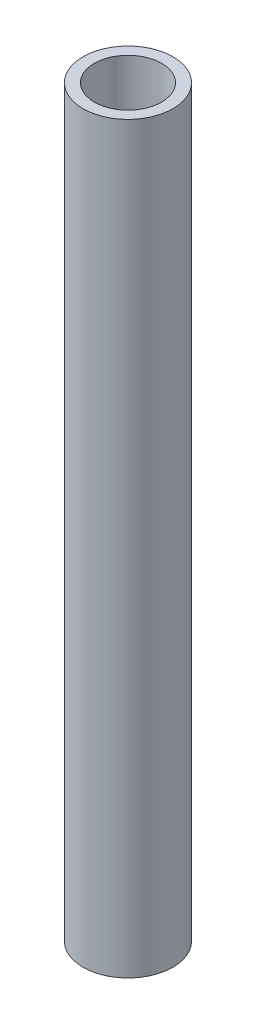
ISO-10303-21;
HEADER;
FILE_DESCRIPTION(('STEP AP214'),'2;1');
FILE_NAME('part.step','',(''),(''),'','','');
FILE_SCHEMA(('AUTOMOTIVE_DESIGN { 1 0 10303 214 1 1 1 1 }'));
ENDSEC;
DATA;
#1=APPLICATION_CONTEXT('core data for automotive mechanical design processes');
#2=APPLICATION_PROTOCOL_DEFINITION('international standard','automotive_design',2000,#1);
#3=PRODUCT_CONTEXT('',#1,'mechanical');
#4=PRODUCT('Part','Part','',(#3));
#5=PRODUCT_RELATED_PRODUCT_CATEGORY('part','',(#4));
#6=PRODUCT_DEFINITION_FORMATION('','',#4);
#7=PRODUCT_DEFINITION_CONTEXT('part definition',#1,'design');
#8=PRODUCT_DEFINITION('design','',#6,#7);
#9=PRODUCT_DEFINITION_SHAPE('','',#8);
#10=(LENGTH_UNIT() NAMED_UNIT(*) SI_UNIT(.MILLI.,.METRE.));
#11=(NAMED_UNIT(*) PLANE_ANGLE_UNIT() SI_UNIT($,.RADIAN.));
#12=(NAMED_UNIT(*) SI_UNIT($,.STERADIAN.) SOLID_ANGLE_UNIT());
#13=UNCERTAINTY_MEASURE_WITH_UNIT(LENGTH_MEASURE(1.E-05),#10,'distance_accuracy_value','');
#14=(GEOMETRIC_REPRESENTATION_CONTEXT(3) GLOBAL_UNCERTAINTY_ASSIGNED_CONTEXT((#13)) GLOBAL_UNIT_ASSIGNED_CONTEXT((#10,
#11,#12)) REPRESENTATION_CONTEXT('',''));
#15=CARTESIAN_POINT('',(0.,0.,0.));
#16=DIRECTION('',(0.,0.,1.));
#17=DIRECTION('',(1.,0.,0.));
#18=AXIS2_PLACEMENT_3D('',#15,#16,#17);
#19=CARTESIAN_POINT('',(0.,210.,0.));
#20=DIRECTION('',(0.,1.,0.));
#21=DIRECTION('',(0.,0.,1.));
#22=AXIS2_PLACEMENT_3D('',#19,#20,#21);
#23=PLANE('',#22);
#24=CARTESIAN_POINT('',(0.,210.,0.));
#25=DIRECTION('',(0.,1.,0.));
#26=DIRECTION('',(0.,0.,1.));
#27=AXIS2_PLACEMENT_3D('',#24,#25,#26);
#28=CIRCLE('',#27,12.7);
#29=CARTESIAN_POINT('',(0.,210.,12.7));
#30=VERTEX_POINT('',#29);
#31=EDGE_CURVE('E10',#30,#30,#28,.T.);
#32=ORIENTED_EDGE('',*,*,#31,.T.);
#33=EDGE_LOOP('',(#32));
#34=FACE_BOUND('',#33,.T.);
#35=CARTESIAN_POINT('',(0.,210.,0.));
#36=DIRECTION('',(0.,1.,0.));
#37=DIRECTION('',(0.,0.,1.));
#38=AXIS2_PLACEMENT_3D('',#35,#36,#37);
#39=CIRCLE('',#38,9.5);
#40=CARTESIAN_POINT('',(0.,210.,9.5));
#41=VERTEX_POINT('',#40);
#42=EDGE_CURVE('E43',#41,#41,#39,.T.);
#43=ORIENTED_EDGE('',*,*,#42,.F.);
#44=EDGE_LOOP('',(#43));
#45=FACE_BOUND('',#44,.T.);
#46=ADVANCED_FACE('F32',(#34,#45),#23,.T.);
#47=CARTESIAN_POINT('',(0.,0.,0.));
#48=DIRECTION('',(0.,1.,0.));
#49=DIRECTION('',(0.,0.,1.));
#50=AXIS2_PLACEMENT_3D('',#47,#48,#49);
#51=PLANE('',#50);
#52=CARTESIAN_POINT('',(0.,0.,0.));
#53=DIRECTION('',(0.,1.,0.));
#54=DIRECTION('',(0.,0.,1.));
#55=AXIS2_PLACEMENT_3D('',#52,#53,#54);
#56=CIRCLE('',#55,12.7);
#57=CARTESIAN_POINT('',(0.,0.,12.7));
#58=VERTEX_POINT('',#57);
#59=EDGE_CURVE('E36',#58,#58,#56,.T.);
#60=ORIENTED_EDGE('',*,*,#59,.F.);
#61=EDGE_LOOP('',(#60));
#62=FACE_BOUND('',#61,.T.);
#63=CARTESIAN_POINT('',(0.,0.,0.));
#64=DIRECTION('',(0.,1.,0.));
#65=DIRECTION('',(0.,0.,1.));
#66=AXIS2_PLACEMENT_3D('',#63,#64,#65);
#67=CIRCLE('',#66,9.5);
#68=CARTESIAN_POINT('',(0.,0.,9.5));
#69=VERTEX_POINT('',#68);
#70=EDGE_CURVE('E45',#69,#69,#67,.T.);
#71=ORIENTED_EDGE('',*,*,#70,.T.);
#72=EDGE_LOOP('',(#71));
#73=FACE_BOUND('',#72,.T.);
#74=ADVANCED_FACE('F55',(#62,#73),#51,.F.);
#75=CARTESIAN_POINT('',(0.,210.,0.));
#76=DIRECTION('',(0.,-1.,0.));
#77=DIRECTION('',(0.,0.,-1.));
#78=AXIS2_PLACEMENT_3D('',#75,#76,#77);
#79=CYLINDRICAL_SURFACE('',#78,12.7);
#80=ORIENTED_EDGE('',*,*,#31,.F.);
#81=EDGE_LOOP('',(#80));
#82=FACE_BOUND('',#81,.T.);
#83=ORIENTED_EDGE('',*,*,#59,.T.);
#84=EDGE_LOOP('',(#83));
#85=FACE_BOUND('',#84,.T.);
#86=ADVANCED_FACE('F34',(#82,#85),#79,.T.);
#87=CARTESIAN_POINT('',(0.,210.,0.));
#88=DIRECTION('',(0.,-1.,0.));
#89=DIRECTION('',(0.,0.,-1.));
#90=AXIS2_PLACEMENT_3D('',#87,#88,#89);
#91=CYLINDRICAL_SURFACE('',#90,9.5);
#92=ORIENTED_EDGE('',*,*,#42,.T.);
#93=EDGE_LOOP('',(#92));
#94=FACE_BOUND('',#93,.T.);
#95=ORIENTED_EDGE('',*,*,#70,.F.);
#96=EDGE_LOOP('',(#95));
#97=FACE_BOUND('',#96,.T.);
#98=ADVANCED_FACE('F51',(#94,#97),#91,.F.);
#99=CLOSED_SHELL('',(#46,#74,#86,#98));
#100=MANIFOLD_SOLID_BREP('B2',#99);
#101=ADVANCED_BREP_SHAPE_REPRESENTATION('',(#18,#100),#14);
#102=SHAPE_DEFINITION_REPRESENTATION(#9,#101);
ENDSEC;
END-ISO-10303-21;
